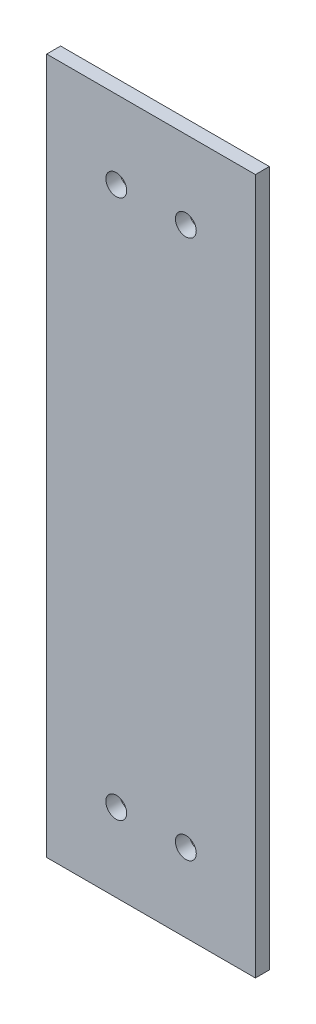
ISO-10303-21;
HEADER;
FILE_DESCRIPTION(('STEP AP214'),'2;1');
FILE_NAME('part.step','',(''),(''),'','','');
FILE_SCHEMA(('AUTOMOTIVE_DESIGN { 1 0 10303 214 1 1 1 1 }'));
ENDSEC;
DATA;
#1=APPLICATION_CONTEXT('core data for automotive mechanical design processes');
#2=APPLICATION_PROTOCOL_DEFINITION('international standard','automotive_design',2000,#1);
#3=PRODUCT_CONTEXT('',#1,'mechanical');
#4=PRODUCT('Part','Part','',(#3));
#5=PRODUCT_RELATED_PRODUCT_CATEGORY('part','',(#4));
#6=PRODUCT_DEFINITION_FORMATION('','',#4);
#7=PRODUCT_DEFINITION_CONTEXT('part definition',#1,'design');
#8=PRODUCT_DEFINITION('design','',#6,#7);
#9=PRODUCT_DEFINITION_SHAPE('','',#8);
#10=(LENGTH_UNIT() NAMED_UNIT(*) SI_UNIT(.MILLI.,.METRE.));
#11=(NAMED_UNIT(*) PLANE_ANGLE_UNIT() SI_UNIT($,.RADIAN.));
#12=(NAMED_UNIT(*) SI_UNIT($,.STERADIAN.) SOLID_ANGLE_UNIT());
#13=UNCERTAINTY_MEASURE_WITH_UNIT(LENGTH_MEASURE(1.E-05),#10,'distance_accuracy_value','');
#14=(GEOMETRIC_REPRESENTATION_CONTEXT(3) GLOBAL_UNCERTAINTY_ASSIGNED_CONTEXT((#13)) GLOBAL_UNIT_ASSIGNED_CONTEXT((#10,
#11,#12)) REPRESENTATION_CONTEXT('',''));
#15=CARTESIAN_POINT('',(0.,0.,0.));
#16=DIRECTION('',(0.,0.,1.));
#17=DIRECTION('',(1.,0.,0.));
#18=AXIS2_PLACEMENT_3D('',#15,#16,#17);
#19=CARTESIAN_POINT('',(0.,0.,2.));
#20=DIRECTION('',(0.,0.,-1.));
#21=DIRECTION('',(-1.,0.,0.));
#22=AXIS2_PLACEMENT_3D('',#19,#20,#21);
#23=PLANE('',#22);
#24=DIRECTION('',(0.,-1.,0.));
#25=VECTOR('',#24,1.);
#26=CARTESIAN_POINT('',(0.,0.,2.));
#27=LINE('',#26,#25);
#28=CARTESIAN_POINT('',(0.,100.,2.));
#29=VERTEX_POINT('',#28);
#30=CARTESIAN_POINT('',(0.,0.,2.));
#31=VERTEX_POINT('',#30);
#32=EDGE_CURVE('E92',#29,#31,#27,.T.);
#33=ORIENTED_EDGE('',*,*,#32,.T.);
#34=DIRECTION('',(1.,0.,0.));
#35=VECTOR('',#34,1.);
#36=CARTESIAN_POINT('',(0.,0.,2.));
#37=LINE('',#36,#35);
#38=CARTESIAN_POINT('',(30.,0.,2.));
#39=VERTEX_POINT('',#38);
#40=EDGE_CURVE('E87',#31,#39,#37,.T.);
#41=ORIENTED_EDGE('',*,*,#40,.T.);
#42=DIRECTION('',(0.,1.,0.));
#43=VECTOR('',#42,1.);
#44=CARTESIAN_POINT('',(30.,0.,2.));
#45=LINE('',#44,#43);
#46=CARTESIAN_POINT('',(30.,100.,2.));
#47=VERTEX_POINT('',#46);
#48=EDGE_CURVE('E90',#39,#47,#45,.T.);
#49=ORIENTED_EDGE('',*,*,#48,.T.);
#50=DIRECTION('',(-1.,0.,0.));
#51=VECTOR('',#50,1.);
#52=CARTESIAN_POINT('',(0.,100.,2.));
#53=LINE('',#52,#51);
#54=EDGE_CURVE('E57',#47,#29,#53,.T.);
#55=ORIENTED_EDGE('',*,*,#54,.T.);
#56=EDGE_LOOP('',(#33,#41,#49,#55));
#57=FACE_BOUND('',#56,.T.);
#58=CARTESIAN_POINT('',(10.,11.25,2.));
#59=DIRECTION('',(0.,0.,1.));
#60=DIRECTION('',(1.,0.,0.));
#61=AXIS2_PLACEMENT_3D('',#58,#59,#60);
#62=CIRCLE('',#61,1.5);
#63=CARTESIAN_POINT('',(11.5,11.25,2.));
#64=VERTEX_POINT('',#63);
#65=EDGE_CURVE('E112',#64,#64,#62,.T.);
#66=ORIENTED_EDGE('',*,*,#65,.F.);
#67=EDGE_LOOP('',(#66));
#68=FACE_BOUND('',#67,.T.);
#69=CARTESIAN_POINT('',(20.,11.25,2.));
#70=DIRECTION('',(0.,0.,1.));
#71=DIRECTION('',(1.,0.,0.));
#72=AXIS2_PLACEMENT_3D('',#69,#70,#71);
#73=CIRCLE('',#72,1.5);
#74=CARTESIAN_POINT('',(21.5,11.25,2.));
#75=VERTEX_POINT('',#74);
#76=EDGE_CURVE('E134',#75,#75,#73,.T.);
#77=ORIENTED_EDGE('',*,*,#76,.F.);
#78=EDGE_LOOP('',(#77));
#79=FACE_BOUND('',#78,.T.);
#80=CARTESIAN_POINT('',(19.9999999999997,88.75,2.));
#81=DIRECTION('',(0.,0.,1.));
#82=DIRECTION('',(1.,0.,0.));
#83=AXIS2_PLACEMENT_3D('',#80,#81,#82);
#84=CIRCLE('',#83,1.5);
#85=CARTESIAN_POINT('',(21.4999999999997,88.75,2.));
#86=VERTEX_POINT('',#85);
#87=EDGE_CURVE('E142',#86,#86,#84,.T.);
#88=ORIENTED_EDGE('',*,*,#87,.F.);
#89=EDGE_LOOP('',(#88));
#90=FACE_BOUND('',#89,.T.);
#91=CARTESIAN_POINT('',(9.99999999999973,88.75,2.));
#92=DIRECTION('',(0.,0.,1.));
#93=DIRECTION('',(1.,0.,0.));
#94=AXIS2_PLACEMENT_3D('',#91,#92,#93);
#95=CIRCLE('',#94,1.5);
#96=CARTESIAN_POINT('',(11.4999999999997,88.75,2.));
#97=VERTEX_POINT('',#96);
#98=EDGE_CURVE('E150',#97,#97,#95,.T.);
#99=ORIENTED_EDGE('',*,*,#98,.F.);
#100=EDGE_LOOP('',(#99));
#101=FACE_BOUND('',#100,.T.);
#102=ADVANCED_FACE('F39',(#57,#68,#79,#90,#101),#23,.F.);
#103=CARTESIAN_POINT('',(0.,0.,0.));
#104=DIRECTION('',(0.,0.,-1.));
#105=DIRECTION('',(-1.,0.,0.));
#106=AXIS2_PLACEMENT_3D('',#103,#104,#105);
#107=PLANE('',#106);
#108=CARTESIAN_POINT('',(19.9999999999997,88.75,0.));
#109=DIRECTION('',(0.,0.,1.));
#110=DIRECTION('',(1.,0.,0.));
#111=AXIS2_PLACEMENT_3D('',#108,#109,#110);
#112=CIRCLE('',#111,1.5);
#113=CARTESIAN_POINT('',(21.4999999999997,88.75,0.));
#114=VERTEX_POINT('',#113);
#115=EDGE_CURVE('E146',#114,#114,#112,.T.);
#116=ORIENTED_EDGE('',*,*,#115,.T.);
#117=EDGE_LOOP('',(#116));
#118=FACE_BOUND('',#117,.T.);
#119=CARTESIAN_POINT('',(10.,11.25,0.));
#120=DIRECTION('',(0.,0.,1.));
#121=DIRECTION('',(1.,0.,0.));
#122=AXIS2_PLACEMENT_3D('',#119,#120,#121);
#123=CIRCLE('',#122,1.5);
#124=CARTESIAN_POINT('',(11.5,11.25,0.));
#125=VERTEX_POINT('',#124);
#126=EDGE_CURVE('E130',#125,#125,#123,.T.);
#127=ORIENTED_EDGE('',*,*,#126,.T.);
#128=EDGE_LOOP('',(#127));
#129=FACE_BOUND('',#128,.T.);
#130=DIRECTION('',(0.,-1.,0.));
#131=VECTOR('',#130,1.);
#132=CARTESIAN_POINT('',(0.,0.,0.));
#133=LINE('',#132,#131);
#134=CARTESIAN_POINT('',(0.,100.,0.));
#135=VERTEX_POINT('',#134);
#136=CARTESIAN_POINT('',(0.,0.,0.));
#137=VERTEX_POINT('',#136);
#138=EDGE_CURVE('E108',#135,#137,#133,.T.);
#139=ORIENTED_EDGE('',*,*,#138,.F.);
#140=DIRECTION('',(-1.,0.,0.));
#141=VECTOR('',#140,1.);
#142=CARTESIAN_POINT('',(0.,100.,0.));
#143=LINE('',#142,#141);
#144=CARTESIAN_POINT('',(30.,100.,0.));
#145=VERTEX_POINT('',#144);
#146=EDGE_CURVE('E80',#145,#135,#143,.T.);
#147=ORIENTED_EDGE('',*,*,#146,.F.);
#148=DIRECTION('',(0.,1.,0.));
#149=VECTOR('',#148,1.);
#150=CARTESIAN_POINT('',(30.,0.,0.));
#151=LINE('',#150,#149);
#152=CARTESIAN_POINT('',(30.,0.,0.));
#153=VERTEX_POINT('',#152);
#154=EDGE_CURVE('E74',#153,#145,#151,.T.);
#155=ORIENTED_EDGE('',*,*,#154,.F.);
#156=DIRECTION('',(1.,0.,0.));
#157=VECTOR('',#156,1.);
#158=CARTESIAN_POINT('',(0.,0.,0.));
#159=LINE('',#158,#157);
#160=EDGE_CURVE('E97',#137,#153,#159,.T.);
#161=ORIENTED_EDGE('',*,*,#160,.F.);
#162=EDGE_LOOP('',(#139,#147,#155,#161));
#163=FACE_BOUND('',#162,.T.);
#164=CARTESIAN_POINT('',(20.,11.25,0.));
#165=DIRECTION('',(0.,0.,1.));
#166=DIRECTION('',(1.,0.,0.));
#167=AXIS2_PLACEMENT_3D('',#164,#165,#166);
#168=CIRCLE('',#167,1.5);
#169=CARTESIAN_POINT('',(21.5,11.25,0.));
#170=VERTEX_POINT('',#169);
#171=EDGE_CURVE('E138',#170,#170,#168,.T.);
#172=ORIENTED_EDGE('',*,*,#171,.T.);
#173=EDGE_LOOP('',(#172));
#174=FACE_BOUND('',#173,.T.);
#175=CARTESIAN_POINT('',(9.99999999999973,88.75,0.));
#176=DIRECTION('',(0.,0.,1.));
#177=DIRECTION('',(1.,0.,0.));
#178=AXIS2_PLACEMENT_3D('',#175,#176,#177);
#179=CIRCLE('',#178,1.5);
#180=CARTESIAN_POINT('',(11.4999999999997,88.75,0.));
#181=VERTEX_POINT('',#180);
#182=EDGE_CURVE('E154',#181,#181,#179,.T.);
#183=ORIENTED_EDGE('',*,*,#182,.T.);
#184=EDGE_LOOP('',(#183));
#185=FACE_BOUND('',#184,.T.);
#186=ADVANCED_FACE('F125',(#118,#129,#163,#174,#185),#107,.T.);
#187=CARTESIAN_POINT('',(0.,0.,2.));
#188=DIRECTION('',(1.,0.,0.));
#189=DIRECTION('',(0.,0.,-1.));
#190=AXIS2_PLACEMENT_3D('',#187,#188,#189);
#191=PLANE('',#190);
#192=ORIENTED_EDGE('',*,*,#138,.T.);
#193=DIRECTION('',(0.,0.,-1.));
#194=VECTOR('',#193,1.);
#195=CARTESIAN_POINT('',(0.,0.,2.));
#196=LINE('',#195,#194);
#197=EDGE_CURVE('E11',#31,#137,#196,.T.);
#198=ORIENTED_EDGE('',*,*,#197,.F.);
#199=ORIENTED_EDGE('',*,*,#32,.F.);
#200=DIRECTION('',(0.,0.,-1.));
#201=VECTOR('',#200,1.);
#202=CARTESIAN_POINT('',(0.,100.,2.));
#203=LINE('',#202,#201);
#204=EDGE_CURVE('E104',#29,#135,#203,.T.);
#205=ORIENTED_EDGE('',*,*,#204,.T.);
#206=EDGE_LOOP('',(#192,#198,#199,#205));
#207=FACE_BOUND('',#206,.T.);
#208=ADVANCED_FACE('F41',(#207),#191,.F.);
#209=CARTESIAN_POINT('',(0.,0.,2.));
#210=DIRECTION('',(0.,1.,0.));
#211=DIRECTION('',(0.,0.,1.));
#212=AXIS2_PLACEMENT_3D('',#209,#210,#211);
#213=PLANE('',#212);
#214=ORIENTED_EDGE('',*,*,#160,.T.);
#215=DIRECTION('',(0.,0.,-1.));
#216=VECTOR('',#215,1.);
#217=CARTESIAN_POINT('',(30.,0.,2.));
#218=LINE('',#217,#216);
#219=EDGE_CURVE('E49',#39,#153,#218,.T.);
#220=ORIENTED_EDGE('',*,*,#219,.F.);
#221=ORIENTED_EDGE('',*,*,#40,.F.);
#222=ORIENTED_EDGE('',*,*,#197,.T.);
#223=EDGE_LOOP('',(#214,#220,#221,#222));
#224=FACE_BOUND('',#223,.T.);
#225=ADVANCED_FACE('F96',(#224),#213,.F.);
#226=CARTESIAN_POINT('',(30.,0.,2.));
#227=DIRECTION('',(-1.,0.,0.));
#228=DIRECTION('',(0.,0.,1.));
#229=AXIS2_PLACEMENT_3D('',#226,#227,#228);
#230=PLANE('',#229);
#231=ORIENTED_EDGE('',*,*,#154,.T.);
#232=DIRECTION('',(0.,0.,-1.));
#233=VECTOR('',#232,1.);
#234=CARTESIAN_POINT('',(30.,100.,2.));
#235=LINE('',#234,#233);
#236=EDGE_CURVE('E99',#47,#145,#235,.T.);
#237=ORIENTED_EDGE('',*,*,#236,.F.);
#238=ORIENTED_EDGE('',*,*,#48,.F.);
#239=ORIENTED_EDGE('',*,*,#219,.T.);
#240=EDGE_LOOP('',(#231,#237,#238,#239));
#241=FACE_BOUND('',#240,.T.);
#242=ADVANCED_FACE('F100',(#241),#230,.F.);
#243=CARTESIAN_POINT('',(0.,100.,2.));
#244=DIRECTION('',(0.,-1.,0.));
#245=DIRECTION('',(0.,0.,-1.));
#246=AXIS2_PLACEMENT_3D('',#243,#244,#245);
#247=PLANE('',#246);
#248=ORIENTED_EDGE('',*,*,#146,.T.);
#249=ORIENTED_EDGE('',*,*,#204,.F.);
#250=ORIENTED_EDGE('',*,*,#54,.F.);
#251=ORIENTED_EDGE('',*,*,#236,.T.);
#252=EDGE_LOOP('',(#248,#249,#250,#251));
#253=FACE_BOUND('',#252,.T.);
#254=ADVANCED_FACE('F122',(#253),#247,.F.);
#255=CARTESIAN_POINT('',(10.,11.25,2.));
#256=DIRECTION('',(0.,0.,-1.));
#257=DIRECTION('',(-1.,0.,0.));
#258=AXIS2_PLACEMENT_3D('',#255,#256,#257);
#259=CYLINDRICAL_SURFACE('',#258,1.5);
#260=ORIENTED_EDGE('',*,*,#65,.T.);
#261=EDGE_LOOP('',(#260));
#262=FACE_BOUND('',#261,.T.);
#263=ORIENTED_EDGE('',*,*,#126,.F.);
#264=EDGE_LOOP('',(#263));
#265=FACE_BOUND('',#264,.T.);
#266=ADVANCED_FACE('F173',(#262,#265),#259,.F.);
#267=CARTESIAN_POINT('',(20.,11.25,2.));
#268=DIRECTION('',(0.,0.,-1.));
#269=DIRECTION('',(-1.,0.,0.));
#270=AXIS2_PLACEMENT_3D('',#267,#268,#269);
#271=CYLINDRICAL_SURFACE('',#270,1.5);
#272=ORIENTED_EDGE('',*,*,#76,.T.);
#273=EDGE_LOOP('',(#272));
#274=FACE_BOUND('',#273,.T.);
#275=ORIENTED_EDGE('',*,*,#171,.F.);
#276=EDGE_LOOP('',(#275));
#277=FACE_BOUND('',#276,.T.);
#278=ADVANCED_FACE('F219',(#274,#277),#271,.F.);
#279=CARTESIAN_POINT('',(19.9999999999997,88.75,2.));
#280=DIRECTION('',(0.,0.,-1.));
#281=DIRECTION('',(-1.,0.,0.));
#282=AXIS2_PLACEMENT_3D('',#279,#280,#281);
#283=CYLINDRICAL_SURFACE('',#282,1.5);
#284=ORIENTED_EDGE('',*,*,#87,.T.);
#285=EDGE_LOOP('',(#284));
#286=FACE_BOUND('',#285,.T.);
#287=ORIENTED_EDGE('',*,*,#115,.F.);
#288=EDGE_LOOP('',(#287));
#289=FACE_BOUND('',#288,.T.);
#290=ADVANCED_FACE('F227',(#286,#289),#283,.F.);
#291=CARTESIAN_POINT('',(9.99999999999973,88.75,2.));
#292=DIRECTION('',(0.,0.,-1.));
#293=DIRECTION('',(-1.,0.,0.));
#294=AXIS2_PLACEMENT_3D('',#291,#292,#293);
#295=CYLINDRICAL_SURFACE('',#294,1.5);
#296=ORIENTED_EDGE('',*,*,#98,.T.);
#297=EDGE_LOOP('',(#296));
#298=FACE_BOUND('',#297,.T.);
#299=ORIENTED_EDGE('',*,*,#182,.F.);
#300=EDGE_LOOP('',(#299));
#301=FACE_BOUND('',#300,.T.);
#302=ADVANCED_FACE('F162',(#298,#301),#295,.F.);
#303=CLOSED_SHELL('',(#102,#186,#208,#225,#242,#254,#266,#278,#290,#302));
#304=MANIFOLD_SOLID_BREP('B2',#303);
#305=ADVANCED_BREP_SHAPE_REPRESENTATION('',(#18,#304),#14);
#306=SHAPE_DEFINITION_REPRESENTATION(#9,#305);
ENDSEC;
END-ISO-10303-21;
